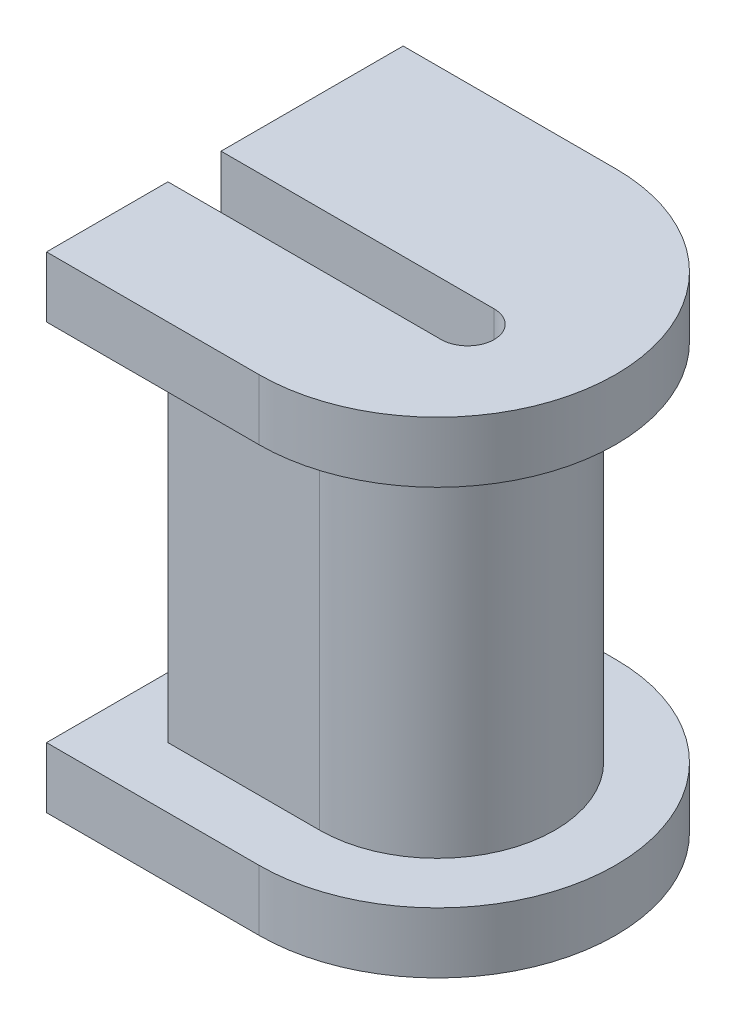
ISO-10303-21;
HEADER;
FILE_DESCRIPTION(('STEP AP214'),'2;1');
FILE_NAME('part.step','',(''),(''),'','','');
FILE_SCHEMA(('AUTOMOTIVE_DESIGN { 1 0 10303 214 1 1 1 1 }'));
ENDSEC;
DATA;
#1=APPLICATION_CONTEXT('core data for automotive mechanical design processes');
#2=APPLICATION_PROTOCOL_DEFINITION('international standard','automotive_design',2000,#1);
#3=PRODUCT_CONTEXT('',#1,'mechanical');
#4=PRODUCT('Part','Part','',(#3));
#5=PRODUCT_RELATED_PRODUCT_CATEGORY('part','',(#4));
#6=PRODUCT_DEFINITION_FORMATION('','',#4);
#7=PRODUCT_DEFINITION_CONTEXT('part definition',#1,'design');
#8=PRODUCT_DEFINITION('design','',#6,#7);
#9=PRODUCT_DEFINITION_SHAPE('','',#8);
#10=(LENGTH_UNIT() NAMED_UNIT(*) SI_UNIT(.MILLI.,.METRE.));
#11=(NAMED_UNIT(*) PLANE_ANGLE_UNIT() SI_UNIT($,.RADIAN.));
#12=(NAMED_UNIT(*) SI_UNIT($,.STERADIAN.) SOLID_ANGLE_UNIT());
#13=UNCERTAINTY_MEASURE_WITH_UNIT(LENGTH_MEASURE(1.E-05),#10,'distance_accuracy_value','');
#14=(GEOMETRIC_REPRESENTATION_CONTEXT(3) GLOBAL_UNCERTAINTY_ASSIGNED_CONTEXT((#13)) GLOBAL_UNIT_ASSIGNED_CONTEXT((#10,
#11,#12)) REPRESENTATION_CONTEXT('',''));
#15=CARTESIAN_POINT('',(0.,0.,0.));
#16=DIRECTION('',(0.,0.,1.));
#17=DIRECTION('',(1.,0.,0.));
#18=AXIS2_PLACEMENT_3D('',#15,#16,#17);
#19=CARTESIAN_POINT('',(0.,6.,-4.));
#20=DIRECTION('',(1.,0.,0.));
#21=DIRECTION('',(0.,0.,-1.));
#22=AXIS2_PLACEMENT_3D('',#19,#20,#21);
#23=PLANE('',#22);
#24=DIRECTION('',(0.,0.,1.));
#25=VECTOR('',#24,1.);
#26=CARTESIAN_POINT('',(0.,-6.,-4.));
#27=LINE('',#26,#25);
#28=CARTESIAN_POINT('',(0.,-6.,-4.));
#29=VERTEX_POINT('',#28);
#30=CARTESIAN_POINT('',(0.,-6.,0.));
#31=VERTEX_POINT('',#30);
#32=EDGE_CURVE('E339',#29,#31,#27,.T.);
#33=ORIENTED_EDGE('',*,*,#32,.T.);
#34=DIRECTION('',(0.,-1.,0.));
#35=VECTOR('',#34,1.);
#36=CARTESIAN_POINT('',(0.,6.,0.));
#37=LINE('',#36,#35);
#38=CARTESIAN_POINT('',(0.,6.,0.));
#39=VERTEX_POINT('',#38);
#40=EDGE_CURVE('E11',#39,#31,#37,.T.);
#41=ORIENTED_EDGE('',*,*,#40,.F.);
#42=DIRECTION('',(0.,0.,1.));
#43=VECTOR('',#42,1.);
#44=CARTESIAN_POINT('',(0.,6.,-4.));
#45=LINE('',#44,#43);
#46=CARTESIAN_POINT('',(0.,6.,-4.));
#47=VERTEX_POINT('',#46);
#48=EDGE_CURVE('E340',#47,#39,#45,.T.);
#49=ORIENTED_EDGE('',*,*,#48,.F.);
#50=DIRECTION('',(0.,-1.,0.));
#51=VECTOR('',#50,1.);
#52=CARTESIAN_POINT('',(0.,6.,-4.));
#53=LINE('',#52,#51);
#54=EDGE_CURVE('E361',#47,#29,#53,.T.);
#55=ORIENTED_EDGE('',*,*,#54,.T.);
#56=EDGE_LOOP('',(#33,#41,#49,#55));
#57=FACE_BOUND('',#56,.T.);
#58=ADVANCED_FACE('F42',(#57),#23,.F.);
#59=CARTESIAN_POINT('',(0.,6.,0.));
#60=DIRECTION('',(0.,0.,-1.));
#61=DIRECTION('',(-1.,0.,0.));
#62=AXIS2_PLACEMENT_3D('',#59,#60,#61);
#63=PLANE('',#62);
#64=ORIENTED_EDGE('',*,*,#40,.T.);
#65=DIRECTION('',(1.,0.,0.));
#66=VECTOR('',#65,1.);
#67=CARTESIAN_POINT('',(-2.,-6.,0.));
#68=LINE('',#67,#66);
#69=CARTESIAN_POINT('',(-2.,-6.,0.));
#70=VERTEX_POINT('',#69);
#71=EDGE_CURVE('E228',#70,#31,#68,.T.);
#72=ORIENTED_EDGE('',*,*,#71,.F.);
#73=DIRECTION('',(0.,1.,0.));
#74=VECTOR('',#73,1.);
#75=CARTESIAN_POINT('',(-2.,-8.,0.));
#76=LINE('',#75,#74);
#77=CARTESIAN_POINT('',(-2.,-8.,0.));
#78=VERTEX_POINT('',#77);
#79=EDGE_CURVE('E202',#78,#70,#76,.T.);
#80=ORIENTED_EDGE('',*,*,#79,.F.);
#81=DIRECTION('',(1.,0.,0.));
#82=VECTOR('',#81,1.);
#83=CARTESIAN_POINT('',(-2.,-8.,0.));
#84=LINE('',#83,#82);
#85=CARTESIAN_POINT('',(7.,-8.,0.));
#86=VERTEX_POINT('',#85);
#87=EDGE_CURVE('E192',#78,#86,#84,.T.);
#88=ORIENTED_EDGE('',*,*,#87,.T.);
#89=DIRECTION('',(0.,-1.,0.));
#90=VECTOR('',#89,1.);
#91=CARTESIAN_POINT('',(7.,6.,0.));
#92=LINE('',#91,#90);
#93=CARTESIAN_POINT('',(7.,8.,0.));
#94=VERTEX_POINT('',#93);
#95=EDGE_CURVE('E51',#94,#86,#92,.T.);
#96=ORIENTED_EDGE('',*,*,#95,.F.);
#97=DIRECTION('',(1.,0.,0.));
#98=VECTOR('',#97,1.);
#99=CARTESIAN_POINT('',(-2.,8.,0.));
#100=LINE('',#99,#98);
#101=CARTESIAN_POINT('',(-2.,8.,0.));
#102=VERTEX_POINT('',#101);
#103=EDGE_CURVE('E292',#102,#94,#100,.T.);
#104=ORIENTED_EDGE('',*,*,#103,.F.);
#105=DIRECTION('',(0.,-1.,0.));
#106=VECTOR('',#105,1.);
#107=CARTESIAN_POINT('',(-2.,8.,0.));
#108=LINE('',#107,#106);
#109=CARTESIAN_POINT('',(-2.,6.,0.));
#110=VERTEX_POINT('',#109);
#111=EDGE_CURVE('E295',#102,#110,#108,.T.);
#112=ORIENTED_EDGE('',*,*,#111,.T.);
#113=DIRECTION('',(1.,0.,0.));
#114=VECTOR('',#113,1.);
#115=CARTESIAN_POINT('',(-2.,6.,0.));
#116=LINE('',#115,#114);
#117=EDGE_CURVE('E274',#110,#39,#116,.T.);
#118=ORIENTED_EDGE('',*,*,#117,.T.);
#119=EDGE_LOOP('',(#64,#72,#80,#88,#96,#104,#112,#118));
#120=FACE_BOUND('',#119,.T.);
#121=ADVANCED_FACE('F200',(#120),#63,.F.);
#122=CARTESIAN_POINT('',(7.,6.,0.875));
#123=DIRECTION('',(0.,-1.,0.));
#124=DIRECTION('',(0.,0.,-1.));
#125=AXIS2_PLACEMENT_3D('',#122,#123,#124);
#126=CYLINDRICAL_SURFACE('',#125,0.875);
#127=ORIENTED_EDGE('',*,*,#95,.T.);
#128=CARTESIAN_POINT('',(7.,-8.,0.875));
#129=DIRECTION('',(0.,-1.,0.));
#130=DIRECTION('',(0.,0.,1.));
#131=AXIS2_PLACEMENT_3D('',#128,#129,#130);
#132=CIRCLE('',#131,0.875);
#133=CARTESIAN_POINT('',(7.,-8.,1.75));
#134=VERTEX_POINT('',#133);
#135=EDGE_CURVE('E178',#86,#134,#132,.T.);
#136=ORIENTED_EDGE('',*,*,#135,.T.);
#137=DIRECTION('',(0.,-1.,0.));
#138=VECTOR('',#137,1.);
#139=CARTESIAN_POINT('',(7.,6.,1.75));
#140=LINE('',#139,#138);
#141=CARTESIAN_POINT('',(7.,8.,1.75));
#142=VERTEX_POINT('',#141);
#143=EDGE_CURVE('E187',#142,#134,#140,.T.);
#144=ORIENTED_EDGE('',*,*,#143,.F.);
#145=CARTESIAN_POINT('',(7.,8.,0.875));
#146=DIRECTION('',(0.,-1.,0.));
#147=DIRECTION('',(0.,0.,1.));
#148=AXIS2_PLACEMENT_3D('',#145,#146,#147);
#149=CIRCLE('',#148,0.875);
#150=EDGE_CURVE('E181',#94,#142,#149,.T.);
#151=ORIENTED_EDGE('',*,*,#150,.F.);
#152=EDGE_LOOP('',(#127,#136,#144,#151));
#153=FACE_BOUND('',#152,.T.);
#154=ADVANCED_FACE('F177',(#153),#126,.F.);
#155=CARTESIAN_POINT('',(7.,6.,1.75));
#156=DIRECTION('',(0.,0.,1.));
#157=DIRECTION('',(1.,0.,0.));
#158=AXIS2_PLACEMENT_3D('',#155,#156,#157);
#159=PLANE('',#158);
#160=ORIENTED_EDGE('',*,*,#143,.T.);
#161=DIRECTION('',(-1.,0.,0.));
#162=VECTOR('',#161,1.);
#163=CARTESIAN_POINT('',(7.,-8.,1.75));
#164=LINE('',#163,#162);
#165=CARTESIAN_POINT('',(-2.,-8.,1.75));
#166=VERTEX_POINT('',#165);
#167=EDGE_CURVE('E196',#134,#166,#164,.T.);
#168=ORIENTED_EDGE('',*,*,#167,.T.);
#169=DIRECTION('',(0.,1.,0.));
#170=VECTOR('',#169,1.);
#171=CARTESIAN_POINT('',(-2.,-8.,1.75));
#172=LINE('',#171,#170);
#173=CARTESIAN_POINT('',(-2.,-6.,1.75));
#174=VERTEX_POINT('',#173);
#175=EDGE_CURVE('E227',#166,#174,#172,.T.);
#176=ORIENTED_EDGE('',*,*,#175,.T.);
#177=DIRECTION('',(-1.,0.,0.));
#178=VECTOR('',#177,1.);
#179=CARTESIAN_POINT('',(7.,-6.,1.75));
#180=LINE('',#179,#178);
#181=CARTESIAN_POINT('',(0.,-6.,1.75));
#182=VERTEX_POINT('',#181);
#183=EDGE_CURVE('E198',#182,#174,#180,.T.);
#184=ORIENTED_EDGE('',*,*,#183,.F.);
#185=DIRECTION('',(0.,-1.,0.));
#186=VECTOR('',#185,1.);
#187=CARTESIAN_POINT('',(0.,6.,1.75));
#188=LINE('',#187,#186);
#189=CARTESIAN_POINT('',(0.,6.,1.75));
#190=VERTEX_POINT('',#189);
#191=EDGE_CURVE('E392',#190,#182,#188,.T.);
#192=ORIENTED_EDGE('',*,*,#191,.F.);
#193=DIRECTION('',(-1.,0.,0.));
#194=VECTOR('',#193,1.);
#195=CARTESIAN_POINT('',(7.,6.,1.75));
#196=LINE('',#195,#194);
#197=CARTESIAN_POINT('',(-2.,6.,1.75));
#198=VERTEX_POINT('',#197);
#199=EDGE_CURVE('E270',#190,#198,#196,.T.);
#200=ORIENTED_EDGE('',*,*,#199,.T.);
#201=DIRECTION('',(0.,-1.,0.));
#202=VECTOR('',#201,1.);
#203=CARTESIAN_POINT('',(-2.,8.,1.75));
#204=LINE('',#203,#202);
#205=CARTESIAN_POINT('',(-2.,8.,1.75));
#206=VERTEX_POINT('',#205);
#207=EDGE_CURVE('E335',#206,#198,#204,.T.);
#208=ORIENTED_EDGE('',*,*,#207,.F.);
#209=DIRECTION('',(-1.,0.,0.));
#210=VECTOR('',#209,1.);
#211=CARTESIAN_POINT('',(7.,8.,1.75));
#212=LINE('',#211,#210);
#213=EDGE_CURVE('E273',#142,#206,#212,.T.);
#214=ORIENTED_EDGE('',*,*,#213,.F.);
#215=EDGE_LOOP('',(#160,#168,#176,#184,#192,#200,#208,#214));
#216=FACE_BOUND('',#215,.T.);
#217=ADVANCED_FACE('F399',(#216),#159,.F.);
#218=CARTESIAN_POINT('',(0.,6.,1.75));
#219=DIRECTION('',(1.,0.,0.));
#220=DIRECTION('',(0.,0.,-1.));
#221=AXIS2_PLACEMENT_3D('',#218,#219,#220);
#222=PLANE('',#221);
#223=DIRECTION('',(0.,0.,1.));
#224=VECTOR('',#223,1.);
#225=CARTESIAN_POINT('',(0.,-6.,1.75));
#226=LINE('',#225,#224);
#227=CARTESIAN_POINT('',(0.,-6.,3.75));
#228=VERTEX_POINT('',#227);
#229=EDGE_CURVE('E365',#182,#228,#226,.T.);
#230=ORIENTED_EDGE('',*,*,#229,.T.);
#231=DIRECTION('',(0.,-1.,0.));
#232=VECTOR('',#231,1.);
#233=CARTESIAN_POINT('',(0.,6.,3.75));
#234=LINE('',#233,#232);
#235=CARTESIAN_POINT('',(0.,6.,3.75));
#236=VERTEX_POINT('',#235);
#237=EDGE_CURVE('E388',#236,#228,#234,.T.);
#238=ORIENTED_EDGE('',*,*,#237,.F.);
#239=DIRECTION('',(0.,0.,1.));
#240=VECTOR('',#239,1.);
#241=CARTESIAN_POINT('',(0.,6.,1.75));
#242=LINE('',#241,#240);
#243=EDGE_CURVE('E344',#190,#236,#242,.T.);
#244=ORIENTED_EDGE('',*,*,#243,.F.);
#245=ORIENTED_EDGE('',*,*,#191,.T.);
#246=EDGE_LOOP('',(#230,#238,#244,#245));
#247=FACE_BOUND('',#246,.T.);
#248=ADVANCED_FACE('F425',(#247),#222,.F.);
#249=CARTESIAN_POINT('',(0.,6.,3.75));
#250=DIRECTION('',(0.,0.,-1.));
#251=DIRECTION('',(-1.,0.,0.));
#252=AXIS2_PLACEMENT_3D('',#249,#250,#251);
#253=PLANE('',#252);
#254=DIRECTION('',(1.,0.,0.));
#255=VECTOR('',#254,1.);
#256=CARTESIAN_POINT('',(0.,-6.,3.75));
#257=LINE('',#256,#255);
#258=CARTESIAN_POINT('',(5.,-6.,3.75));
#259=VERTEX_POINT('',#258);
#260=EDGE_CURVE('E369',#228,#259,#257,.T.);
#261=ORIENTED_EDGE('',*,*,#260,.T.);
#262=DIRECTION('',(0.,-1.,0.));
#263=VECTOR('',#262,1.);
#264=CARTESIAN_POINT('',(5.,6.,3.75));
#265=LINE('',#264,#263);
#266=CARTESIAN_POINT('',(5.,6.,3.75));
#267=VERTEX_POINT('',#266);
#268=EDGE_CURVE('E384',#267,#259,#265,.T.);
#269=ORIENTED_EDGE('',*,*,#268,.F.);
#270=DIRECTION('',(1.,0.,0.));
#271=VECTOR('',#270,1.);
#272=CARTESIAN_POINT('',(0.,6.,3.75));
#273=LINE('',#272,#271);
#274=EDGE_CURVE('E349',#236,#267,#273,.T.);
#275=ORIENTED_EDGE('',*,*,#274,.F.);
#276=ORIENTED_EDGE('',*,*,#237,.T.);
#277=EDGE_LOOP('',(#261,#269,#275,#276));
#278=FACE_BOUND('',#277,.T.);
#279=ADVANCED_FACE('F422',(#278),#253,.F.);
#280=CARTESIAN_POINT('',(5.,6.,-0.125));
#281=DIRECTION('',(0.,-1.,0.));
#282=DIRECTION('',(0.,0.,-1.));
#283=AXIS2_PLACEMENT_3D('',#280,#281,#282);
#284=CYLINDRICAL_SURFACE('',#283,3.875);
#285=CARTESIAN_POINT('',(5.,-6.,-0.125));
#286=DIRECTION('',(0.,1.,0.));
#287=DIRECTION('',(0.,0.,1.));
#288=AXIS2_PLACEMENT_3D('',#285,#286,#287);
#289=CIRCLE('',#288,3.875);
#290=CARTESIAN_POINT('',(5.,-6.,-4.));
#291=VERTEX_POINT('',#290);
#292=EDGE_CURVE('E373',#259,#291,#289,.T.);
#293=ORIENTED_EDGE('',*,*,#292,.T.);
#294=DIRECTION('',(0.,-1.,0.));
#295=VECTOR('',#294,1.);
#296=CARTESIAN_POINT('',(5.,6.,-4.));
#297=LINE('',#296,#295);
#298=CARTESIAN_POINT('',(5.,6.,-4.));
#299=VERTEX_POINT('',#298);
#300=EDGE_CURVE('E58',#299,#291,#297,.T.);
#301=ORIENTED_EDGE('',*,*,#300,.F.);
#302=CARTESIAN_POINT('',(5.,6.,-0.125));
#303=DIRECTION('',(0.,1.,0.));
#304=DIRECTION('',(0.,0.,1.));
#305=AXIS2_PLACEMENT_3D('',#302,#303,#304);
#306=CIRCLE('',#305,3.875);
#307=EDGE_CURVE('E353',#267,#299,#306,.T.);
#308=ORIENTED_EDGE('',*,*,#307,.F.);
#309=ORIENTED_EDGE('',*,*,#268,.T.);
#310=EDGE_LOOP('',(#293,#301,#308,#309));
#311=FACE_BOUND('',#310,.T.);
#312=ADVANCED_FACE('F419',(#311),#284,.T.);
#313=CARTESIAN_POINT('',(5.,6.,-4.));
#314=DIRECTION('',(0.,0.,1.));
#315=DIRECTION('',(1.,0.,0.));
#316=AXIS2_PLACEMENT_3D('',#313,#314,#315);
#317=PLANE('',#316);
#318=DIRECTION('',(-1.,0.,0.));
#319=VECTOR('',#318,1.);
#320=CARTESIAN_POINT('',(5.,-6.,-4.));
#321=LINE('',#320,#319);
#322=EDGE_CURVE('E345',#291,#29,#321,.T.);
#323=ORIENTED_EDGE('',*,*,#322,.T.);
#324=ORIENTED_EDGE('',*,*,#54,.F.);
#325=DIRECTION('',(-1.,0.,0.));
#326=VECTOR('',#325,1.);
#327=CARTESIAN_POINT('',(5.,6.,-4.));
#328=LINE('',#327,#326);
#329=EDGE_CURVE('E357',#299,#47,#328,.T.);
#330=ORIENTED_EDGE('',*,*,#329,.F.);
#331=ORIENTED_EDGE('',*,*,#300,.T.);
#332=EDGE_LOOP('',(#323,#324,#330,#331));
#333=FACE_BOUND('',#332,.T.);
#334=ADVANCED_FACE('F415',(#333),#317,.F.);
#335=CARTESIAN_POINT('',(7.,6.,0.875));
#336=DIRECTION('',(0.,1.,0.));
#337=DIRECTION('',(0.,0.,1.));
#338=AXIS2_PLACEMENT_3D('',#335,#336,#337);
#339=PLANE('',#338);
#340=ORIENTED_EDGE('',*,*,#329,.T.);
#341=ORIENTED_EDGE('',*,*,#48,.T.);
#342=ORIENTED_EDGE('',*,*,#117,.F.);
#343=DIRECTION('',(0.,0.,1.));
#344=VECTOR('',#343,1.);
#345=CARTESIAN_POINT('',(-2.,6.,-6.));
#346=LINE('',#345,#344);
#347=CARTESIAN_POINT('',(-2.,6.,-6.));
#348=VERTEX_POINT('',#347);
#349=EDGE_CURVE('E310',#348,#110,#346,.T.);
#350=ORIENTED_EDGE('',*,*,#349,.F.);
#351=DIRECTION('',(-1.,0.,0.));
#352=VECTOR('',#351,1.);
#353=CARTESIAN_POINT('',(5.,6.,-6.));
#354=LINE('',#353,#352);
#355=CARTESIAN_POINT('',(5.,6.,-6.));
#356=VERTEX_POINT('',#355);
#357=EDGE_CURVE('E307',#356,#348,#354,.T.);
#358=ORIENTED_EDGE('',*,*,#357,.F.);
#359=CARTESIAN_POINT('',(5.,6.,-0.125));
#360=DIRECTION('',(0.,1.,0.));
#361=DIRECTION('',(0.,0.,1.));
#362=AXIS2_PLACEMENT_3D('',#359,#360,#361);
#363=CIRCLE('',#362,5.875);
#364=CARTESIAN_POINT('',(5.,6.,5.75));
#365=VERTEX_POINT('',#364);
#366=EDGE_CURVE('E304',#365,#356,#363,.T.);
#367=ORIENTED_EDGE('',*,*,#366,.F.);
#368=DIRECTION('',(1.,0.,0.));
#369=VECTOR('',#368,1.);
#370=CARTESIAN_POINT('',(-2.,6.,5.75));
#371=LINE('',#370,#369);
#372=CARTESIAN_POINT('',(-2.,6.,5.75));
#373=VERTEX_POINT('',#372);
#374=EDGE_CURVE('E301',#373,#365,#371,.T.);
#375=ORIENTED_EDGE('',*,*,#374,.F.);
#376=DIRECTION('',(0.,0.,1.));
#377=VECTOR('',#376,1.);
#378=CARTESIAN_POINT('',(-2.,6.,1.75));
#379=LINE('',#378,#377);
#380=EDGE_CURVE('E298',#198,#373,#379,.T.);
#381=ORIENTED_EDGE('',*,*,#380,.F.);
#382=ORIENTED_EDGE('',*,*,#199,.F.);
#383=ORIENTED_EDGE('',*,*,#243,.T.);
#384=ORIENTED_EDGE('',*,*,#274,.T.);
#385=ORIENTED_EDGE('',*,*,#307,.T.);
#386=EDGE_LOOP('',(#340,#341,#342,#350,#358,#367,#375,#381,#382,#383,#384,#385));
#387=FACE_BOUND('',#386,.T.);
#388=ADVANCED_FACE('F410',(#387),#339,.F.);
#389=CARTESIAN_POINT('',(-2.,8.,1.75));
#390=DIRECTION('',(1.,0.,0.));
#391=DIRECTION('',(0.,0.,-1.));
#392=AXIS2_PLACEMENT_3D('',#389,#390,#391);
#393=PLANE('',#392);
#394=ORIENTED_EDGE('',*,*,#380,.T.);
#395=DIRECTION('',(0.,-1.,0.));
#396=VECTOR('',#395,1.);
#397=CARTESIAN_POINT('',(-2.,8.,5.75));
#398=LINE('',#397,#396);
#399=CARTESIAN_POINT('',(-2.,8.,5.75));
#400=VERTEX_POINT('',#399);
#401=EDGE_CURVE('E331',#400,#373,#398,.T.);
#402=ORIENTED_EDGE('',*,*,#401,.F.);
#403=DIRECTION('',(0.,0.,1.));
#404=VECTOR('',#403,1.);
#405=CARTESIAN_POINT('',(-2.,8.,1.75));
#406=LINE('',#405,#404);
#407=EDGE_CURVE('E277',#206,#400,#406,.T.);
#408=ORIENTED_EDGE('',*,*,#407,.F.);
#409=ORIENTED_EDGE('',*,*,#207,.T.);
#410=EDGE_LOOP('',(#394,#402,#408,#409));
#411=FACE_BOUND('',#410,.T.);
#412=ADVANCED_FACE('F474',(#411),#393,.F.);
#413=CARTESIAN_POINT('',(-2.,8.,5.75));
#414=DIRECTION('',(0.,0.,-1.));
#415=DIRECTION('',(-1.,0.,0.));
#416=AXIS2_PLACEMENT_3D('',#413,#414,#415);
#417=PLANE('',#416);
#418=ORIENTED_EDGE('',*,*,#374,.T.);
#419=DIRECTION('',(0.,-1.,0.));
#420=VECTOR('',#419,1.);
#421=CARTESIAN_POINT('',(5.,8.,5.75));
#422=LINE('',#421,#420);
#423=CARTESIAN_POINT('',(5.,8.,5.75));
#424=VERTEX_POINT('',#423);
#425=EDGE_CURVE('E327',#424,#365,#422,.T.);
#426=ORIENTED_EDGE('',*,*,#425,.F.);
#427=DIRECTION('',(1.,0.,0.));
#428=VECTOR('',#427,1.);
#429=CARTESIAN_POINT('',(-2.,8.,5.75));
#430=LINE('',#429,#428);
#431=EDGE_CURVE('E280',#400,#424,#430,.T.);
#432=ORIENTED_EDGE('',*,*,#431,.F.);
#433=ORIENTED_EDGE('',*,*,#401,.T.);
#434=EDGE_LOOP('',(#418,#426,#432,#433));
#435=FACE_BOUND('',#434,.T.);
#436=ADVANCED_FACE('F477',(#435),#417,.F.);
#437=CARTESIAN_POINT('',(5.,8.,-0.125));
#438=DIRECTION('',(0.,-1.,0.));
#439=DIRECTION('',(0.,0.,-1.));
#440=AXIS2_PLACEMENT_3D('',#437,#438,#439);
#441=CYLINDRICAL_SURFACE('',#440,5.875);
#442=ORIENTED_EDGE('',*,*,#366,.T.);
#443=DIRECTION('',(0.,-1.,0.));
#444=VECTOR('',#443,1.);
#445=CARTESIAN_POINT('',(5.,8.,-6.));
#446=LINE('',#445,#444);
#447=CARTESIAN_POINT('',(5.,8.,-6.));
#448=VERTEX_POINT('',#447);
#449=EDGE_CURVE('E323',#448,#356,#446,.T.);
#450=ORIENTED_EDGE('',*,*,#449,.F.);
#451=CARTESIAN_POINT('',(5.,8.,-0.125));
#452=DIRECTION('',(0.,1.,0.));
#453=DIRECTION('',(0.,0.,1.));
#454=AXIS2_PLACEMENT_3D('',#451,#452,#453);
#455=CIRCLE('',#454,5.875);
#456=EDGE_CURVE('E283',#424,#448,#455,.T.);
#457=ORIENTED_EDGE('',*,*,#456,.F.);
#458=ORIENTED_EDGE('',*,*,#425,.T.);
#459=EDGE_LOOP('',(#442,#450,#457,#458));
#460=FACE_BOUND('',#459,.T.);
#461=ADVANCED_FACE('F481',(#460),#441,.T.);
#462=CARTESIAN_POINT('',(5.,8.,-6.));
#463=DIRECTION('',(0.,0.,1.));
#464=DIRECTION('',(1.,0.,0.));
#465=AXIS2_PLACEMENT_3D('',#462,#463,#464);
#466=PLANE('',#465);
#467=ORIENTED_EDGE('',*,*,#357,.T.);
#468=DIRECTION('',(0.,-1.,0.));
#469=VECTOR('',#468,1.);
#470=CARTESIAN_POINT('',(-2.,8.,-6.));
#471=LINE('',#470,#469);
#472=CARTESIAN_POINT('',(-2.,8.,-6.));
#473=VERTEX_POINT('',#472);
#474=EDGE_CURVE('E319',#473,#348,#471,.T.);
#475=ORIENTED_EDGE('',*,*,#474,.F.);
#476=DIRECTION('',(-1.,0.,0.));
#477=VECTOR('',#476,1.);
#478=CARTESIAN_POINT('',(5.,8.,-6.));
#479=LINE('',#478,#477);
#480=EDGE_CURVE('E286',#448,#473,#479,.T.);
#481=ORIENTED_EDGE('',*,*,#480,.F.);
#482=ORIENTED_EDGE('',*,*,#449,.T.);
#483=EDGE_LOOP('',(#467,#475,#481,#482));
#484=FACE_BOUND('',#483,.T.);
#485=ADVANCED_FACE('F485',(#484),#466,.F.);
#486=CARTESIAN_POINT('',(-2.,8.,-6.));
#487=DIRECTION('',(1.,0.,0.));
#488=DIRECTION('',(0.,0.,-1.));
#489=AXIS2_PLACEMENT_3D('',#486,#487,#488);
#490=PLANE('',#489);
#491=ORIENTED_EDGE('',*,*,#349,.T.);
#492=ORIENTED_EDGE('',*,*,#111,.F.);
#493=DIRECTION('',(0.,0.,1.));
#494=VECTOR('',#493,1.);
#495=CARTESIAN_POINT('',(-2.,8.,-6.));
#496=LINE('',#495,#494);
#497=EDGE_CURVE('E289',#473,#102,#496,.T.);
#498=ORIENTED_EDGE('',*,*,#497,.F.);
#499=ORIENTED_EDGE('',*,*,#474,.T.);
#500=EDGE_LOOP('',(#491,#492,#498,#499));
#501=FACE_BOUND('',#500,.T.);
#502=ADVANCED_FACE('F453',(#501),#490,.F.);
#503=CARTESIAN_POINT('',(7.,8.,0.875));
#504=DIRECTION('',(0.,1.,0.));
#505=DIRECTION('',(0.,0.,1.));
#506=AXIS2_PLACEMENT_3D('',#503,#504,#505);
#507=PLANE('',#506);
#508=ORIENTED_EDGE('',*,*,#150,.T.);
#509=ORIENTED_EDGE('',*,*,#213,.T.);
#510=ORIENTED_EDGE('',*,*,#407,.T.);
#511=ORIENTED_EDGE('',*,*,#431,.T.);
#512=ORIENTED_EDGE('',*,*,#456,.T.);
#513=ORIENTED_EDGE('',*,*,#480,.T.);
#514=ORIENTED_EDGE('',*,*,#497,.T.);
#515=ORIENTED_EDGE('',*,*,#103,.T.);
#516=EDGE_LOOP('',(#508,#509,#510,#511,#512,#513,#514,#515));
#517=FACE_BOUND('',#516,.T.);
#518=ADVANCED_FACE('F403',(#517),#507,.T.);
#519=CARTESIAN_POINT('',(-2.,-8.,-6.));
#520=DIRECTION('',(-1.,0.,0.));
#521=DIRECTION('',(0.,0.,1.));
#522=AXIS2_PLACEMENT_3D('',#519,#520,#521);
#523=PLANE('',#522);
#524=DIRECTION('',(0.,0.,1.));
#525=VECTOR('',#524,1.);
#526=CARTESIAN_POINT('',(-2.,-6.,-6.));
#527=LINE('',#526,#525);
#528=CARTESIAN_POINT('',(-2.,-6.,-6.));
#529=VERTEX_POINT('',#528);
#530=EDGE_CURVE('E231',#529,#70,#527,.T.);
#531=ORIENTED_EDGE('',*,*,#530,.F.);
#532=DIRECTION('',(0.,1.,0.));
#533=VECTOR('',#532,1.);
#534=CARTESIAN_POINT('',(-2.,-8.,-6.));
#535=LINE('',#534,#533);
#536=CARTESIAN_POINT('',(-2.,-8.,-6.));
#537=VERTEX_POINT('',#536);
#538=EDGE_CURVE('E265',#537,#529,#535,.T.);
#539=ORIENTED_EDGE('',*,*,#538,.F.);
#540=DIRECTION('',(0.,0.,1.));
#541=VECTOR('',#540,1.);
#542=CARTESIAN_POINT('',(-2.,-8.,-6.));
#543=LINE('',#542,#541);
#544=EDGE_CURVE('E204',#537,#78,#543,.T.);
#545=ORIENTED_EDGE('',*,*,#544,.T.);
#546=ORIENTED_EDGE('',*,*,#79,.T.);
#547=EDGE_LOOP('',(#531,#539,#545,#546));
#548=FACE_BOUND('',#547,.T.);
#549=ADVANCED_FACE('F445',(#548),#523,.T.);
#550=CARTESIAN_POINT('',(5.,-8.,-6.));
#551=DIRECTION('',(0.,0.,-1.));
#552=DIRECTION('',(-1.,0.,0.));
#553=AXIS2_PLACEMENT_3D('',#550,#551,#552);
#554=PLANE('',#553);
#555=DIRECTION('',(-1.,0.,0.));
#556=VECTOR('',#555,1.);
#557=CARTESIAN_POINT('',(5.,-6.,-6.));
#558=LINE('',#557,#556);
#559=CARTESIAN_POINT('',(5.,-6.,-6.));
#560=VERTEX_POINT('',#559);
#561=EDGE_CURVE('E235',#560,#529,#558,.T.);
#562=ORIENTED_EDGE('',*,*,#561,.F.);
#563=DIRECTION('',(0.,1.,0.));
#564=VECTOR('',#563,1.);
#565=CARTESIAN_POINT('',(5.,-8.,-6.));
#566=LINE('',#565,#564);
#567=CARTESIAN_POINT('',(5.,-8.,-6.));
#568=VERTEX_POINT('',#567);
#569=EDGE_CURVE('E262',#568,#560,#566,.T.);
#570=ORIENTED_EDGE('',*,*,#569,.F.);
#571=DIRECTION('',(-1.,0.,0.));
#572=VECTOR('',#571,1.);
#573=CARTESIAN_POINT('',(5.,-8.,-6.));
#574=LINE('',#573,#572);
#575=EDGE_CURVE('E207',#568,#537,#574,.T.);
#576=ORIENTED_EDGE('',*,*,#575,.T.);
#577=ORIENTED_EDGE('',*,*,#538,.T.);
#578=EDGE_LOOP('',(#562,#570,#576,#577));
#579=FACE_BOUND('',#578,.T.);
#580=ADVANCED_FACE('F442',(#579),#554,.T.);
#581=CARTESIAN_POINT('',(5.,-8.,-0.125));
#582=DIRECTION('',(0.,1.,0.));
#583=DIRECTION('',(0.,0.,1.));
#584=AXIS2_PLACEMENT_3D('',#581,#582,#583);
#585=CYLINDRICAL_SURFACE('',#584,5.875);
#586=CARTESIAN_POINT('',(5.,-6.,-0.125));
#587=DIRECTION('',(0.,1.,0.));
#588=DIRECTION('',(0.,0.,1.));
#589=AXIS2_PLACEMENT_3D('',#586,#587,#588);
#590=CIRCLE('',#589,5.875);
#591=CARTESIAN_POINT('',(5.,-6.,5.75));
#592=VERTEX_POINT('',#591);
#593=EDGE_CURVE('E239',#592,#560,#590,.T.);
#594=ORIENTED_EDGE('',*,*,#593,.F.);
#595=DIRECTION('',(0.,1.,0.));
#596=VECTOR('',#595,1.);
#597=CARTESIAN_POINT('',(5.,-8.,5.75));
#598=LINE('',#597,#596);
#599=CARTESIAN_POINT('',(5.,-8.,5.75));
#600=VERTEX_POINT('',#599);
#601=EDGE_CURVE('E259',#600,#592,#598,.T.);
#602=ORIENTED_EDGE('',*,*,#601,.F.);
#603=CARTESIAN_POINT('',(5.,-8.,-0.125));
#604=DIRECTION('',(0.,1.,0.));
#605=DIRECTION('',(0.,0.,1.));
#606=AXIS2_PLACEMENT_3D('',#603,#604,#605);
#607=CIRCLE('',#606,5.875);
#608=EDGE_CURVE('E213',#600,#568,#607,.T.);
#609=ORIENTED_EDGE('',*,*,#608,.T.);
#610=ORIENTED_EDGE('',*,*,#569,.T.);
#611=EDGE_LOOP('',(#594,#602,#609,#610));
#612=FACE_BOUND('',#611,.T.);
#613=ADVANCED_FACE('F438',(#612),#585,.T.);
#614=CARTESIAN_POINT('',(-2.,-8.,5.75));
#615=DIRECTION('',(0.,0.,1.));
#616=DIRECTION('',(1.,0.,0.));
#617=AXIS2_PLACEMENT_3D('',#614,#615,#616);
#618=PLANE('',#617);
#619=DIRECTION('',(1.,0.,0.));
#620=VECTOR('',#619,1.);
#621=CARTESIAN_POINT('',(-2.,-6.,5.75));
#622=LINE('',#621,#620);
#623=CARTESIAN_POINT('',(-2.,-6.,5.75));
#624=VERTEX_POINT('',#623);
#625=EDGE_CURVE('E243',#624,#592,#622,.T.);
#626=ORIENTED_EDGE('',*,*,#625,.F.);
#627=DIRECTION('',(0.,1.,0.));
#628=VECTOR('',#627,1.);
#629=CARTESIAN_POINT('',(-2.,-8.,5.75));
#630=LINE('',#629,#628);
#631=CARTESIAN_POINT('',(-2.,-8.,5.75));
#632=VERTEX_POINT('',#631);
#633=EDGE_CURVE('E256',#632,#624,#630,.T.);
#634=ORIENTED_EDGE('',*,*,#633,.F.);
#635=DIRECTION('',(1.,0.,0.));
#636=VECTOR('',#635,1.);
#637=CARTESIAN_POINT('',(-2.,-8.,5.75));
#638=LINE('',#637,#636);
#639=EDGE_CURVE('E217',#632,#600,#638,.T.);
#640=ORIENTED_EDGE('',*,*,#639,.T.);
#641=ORIENTED_EDGE('',*,*,#601,.T.);
#642=EDGE_LOOP('',(#626,#634,#640,#641));
#643=FACE_BOUND('',#642,.T.);
#644=ADVANCED_FACE('F434',(#643),#618,.T.);
#645=CARTESIAN_POINT('',(-2.,-8.,1.75));
#646=DIRECTION('',(-1.,0.,0.));
#647=DIRECTION('',(0.,0.,1.));
#648=AXIS2_PLACEMENT_3D('',#645,#646,#647);
#649=PLANE('',#648);
#650=DIRECTION('',(0.,0.,1.));
#651=VECTOR('',#650,1.);
#652=CARTESIAN_POINT('',(-2.,-6.,1.75));
#653=LINE('',#652,#651);
#654=EDGE_CURVE('E247',#174,#624,#653,.T.);
#655=ORIENTED_EDGE('',*,*,#654,.F.);
#656=ORIENTED_EDGE('',*,*,#175,.F.);
#657=DIRECTION('',(0.,0.,1.));
#658=VECTOR('',#657,1.);
#659=CARTESIAN_POINT('',(-2.,-8.,1.75));
#660=LINE('',#659,#658);
#661=EDGE_CURVE('E221',#166,#632,#660,.T.);
#662=ORIENTED_EDGE('',*,*,#661,.T.);
#663=ORIENTED_EDGE('',*,*,#633,.T.);
#664=EDGE_LOOP('',(#655,#656,#662,#663));
#665=FACE_BOUND('',#664,.T.);
#666=ADVANCED_FACE('F431',(#665),#649,.T.);
#667=CARTESIAN_POINT('',(7.,-8.,0.875));
#668=DIRECTION('',(0.,-1.,0.));
#669=DIRECTION('',(0.,0.,1.));
#670=AXIS2_PLACEMENT_3D('',#667,#668,#669);
#671=PLANE('',#670);
#672=ORIENTED_EDGE('',*,*,#135,.F.);
#673=ORIENTED_EDGE('',*,*,#87,.F.);
#674=ORIENTED_EDGE('',*,*,#544,.F.);
#675=ORIENTED_EDGE('',*,*,#575,.F.);
#676=ORIENTED_EDGE('',*,*,#608,.F.);
#677=ORIENTED_EDGE('',*,*,#639,.F.);
#678=ORIENTED_EDGE('',*,*,#661,.F.);
#679=ORIENTED_EDGE('',*,*,#167,.F.);
#680=EDGE_LOOP('',(#672,#673,#674,#675,#676,#677,#678,#679));
#681=FACE_BOUND('',#680,.T.);
#682=ADVANCED_FACE('F190',(#681),#671,.T.);
#683=CARTESIAN_POINT('',(7.,-6.,0.875));
#684=DIRECTION('',(0.,-1.,0.));
#685=DIRECTION('',(0.,0.,1.));
#686=AXIS2_PLACEMENT_3D('',#683,#684,#685);
#687=PLANE('',#686);
#688=ORIENTED_EDGE('',*,*,#32,.F.);
#689=ORIENTED_EDGE('',*,*,#322,.F.);
#690=ORIENTED_EDGE('',*,*,#292,.F.);
#691=ORIENTED_EDGE('',*,*,#260,.F.);
#692=ORIENTED_EDGE('',*,*,#229,.F.);
#693=ORIENTED_EDGE('',*,*,#183,.T.);
#694=ORIENTED_EDGE('',*,*,#654,.T.);
#695=ORIENTED_EDGE('',*,*,#625,.T.);
#696=ORIENTED_EDGE('',*,*,#593,.T.);
#697=ORIENTED_EDGE('',*,*,#561,.T.);
#698=ORIENTED_EDGE('',*,*,#530,.T.);
#699=ORIENTED_EDGE('',*,*,#71,.T.);
#700=EDGE_LOOP('',(#688,#689,#690,#691,#692,#693,#694,#695,#696,#697,#698,#699));
#701=FACE_BOUND('',#700,.T.);
#702=ADVANCED_FACE('F417',(#701),#687,.F.);
#703=CLOSED_SHELL('',(#58,#121,#154,#217,#248,#279,#312,#334,#388,#412,#436,#461,#485,#502,#518,
#549,#580,#613,#644,#666,#682,#702));
#704=MANIFOLD_SOLID_BREP('B2',#703);
#705=ADVANCED_BREP_SHAPE_REPRESENTATION('',(#18,#704),#14);
#706=SHAPE_DEFINITION_REPRESENTATION(#9,#705);
ENDSEC;
END-ISO-10303-21;
